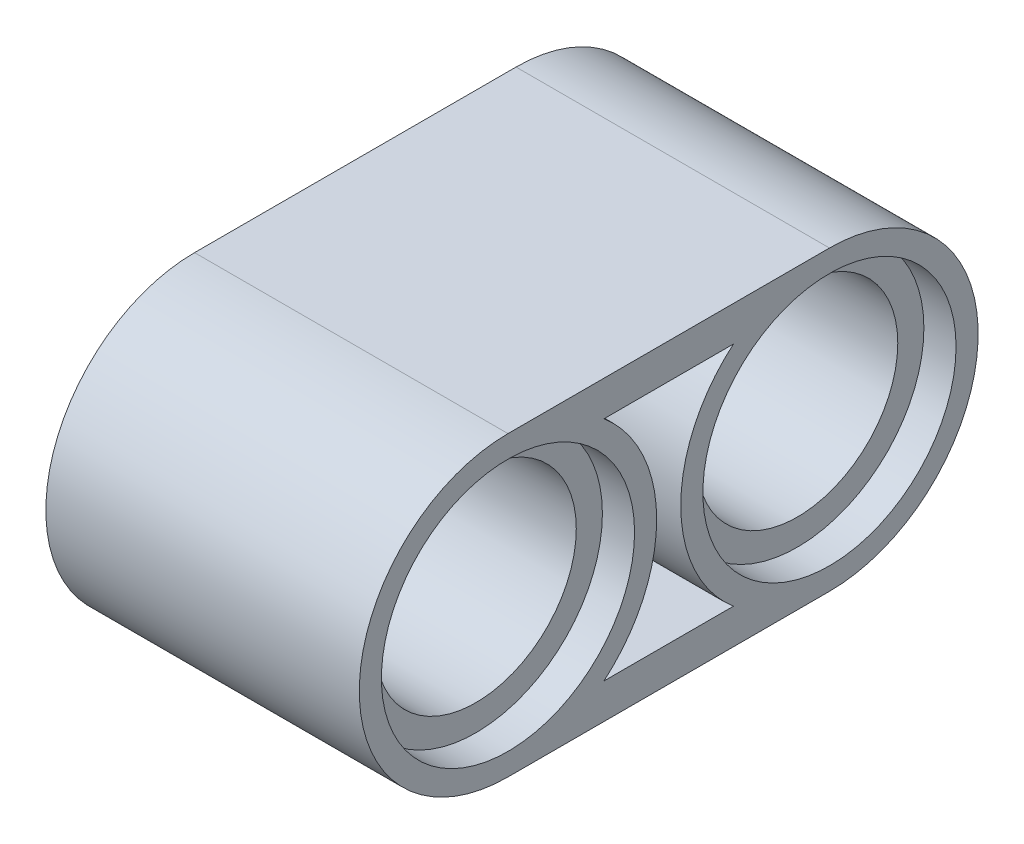
ISO-10303-21;
HEADER;
FILE_DESCRIPTION(('STEP AP214'),'2;1');
FILE_NAME('part.step','',(''),(''),'','','');
FILE_SCHEMA(('AUTOMOTIVE_DESIGN { 1 0 10303 214 1 1 1 1 }'));
ENDSEC;
DATA;
#1=APPLICATION_CONTEXT('core data for automotive mechanical design processes');
#2=APPLICATION_PROTOCOL_DEFINITION('international standard','automotive_design',2000,#1);
#3=PRODUCT_CONTEXT('',#1,'mechanical');
#4=PRODUCT('Part','Part','',(#3));
#5=PRODUCT_RELATED_PRODUCT_CATEGORY('part','',(#4));
#6=PRODUCT_DEFINITION_FORMATION('','',#4);
#7=PRODUCT_DEFINITION_CONTEXT('part definition',#1,'design');
#8=PRODUCT_DEFINITION('design','',#6,#7);
#9=PRODUCT_DEFINITION_SHAPE('','',#8);
#10=(LENGTH_UNIT() NAMED_UNIT(*) SI_UNIT(.MILLI.,.METRE.));
#11=(NAMED_UNIT(*) PLANE_ANGLE_UNIT() SI_UNIT($,.RADIAN.));
#12=(NAMED_UNIT(*) SI_UNIT($,.STERADIAN.) SOLID_ANGLE_UNIT());
#13=UNCERTAINTY_MEASURE_WITH_UNIT(LENGTH_MEASURE(1.E-05),#10,'distance_accuracy_value','');
#14=(GEOMETRIC_REPRESENTATION_CONTEXT(3) GLOBAL_UNCERTAINTY_ASSIGNED_CONTEXT((#13)) GLOBAL_UNIT_ASSIGNED_CONTEXT((#10,
#11,#12)) REPRESENTATION_CONTEXT('',''));
#15=CARTESIAN_POINT('',(0.,0.,0.));
#16=DIRECTION('',(0.,0.,1.));
#17=DIRECTION('',(1.,0.,0.));
#18=AXIS2_PLACEMENT_3D('',#15,#16,#17);
#19=CARTESIAN_POINT('',(7.8,0.,0.));
#20=DIRECTION('',(1.,0.,0.));
#21=DIRECTION('',(0.,0.,-1.));
#22=AXIS2_PLACEMENT_3D('',#19,#20,#21);
#23=PLANE('',#22);
#24=CARTESIAN_POINT('',(7.8,0.,-4.));
#25=DIRECTION('',(1.,0.,0.));
#26=DIRECTION('',(0.,0.,-1.));
#27=AXIS2_PLACEMENT_3D('',#24,#25,#26);
#28=CIRCLE('',#27,3.15);
#29=CARTESIAN_POINT('',(7.8,0.,-7.15));
#30=VERTEX_POINT('',#29);
#31=EDGE_CURVE('E44',#30,#30,#28,.T.);
#32=ORIENTED_EDGE('',*,*,#31,.F.);
#33=EDGE_LOOP('',(#32));
#34=FACE_BOUND('',#33,.T.);
#35=CARTESIAN_POINT('',(7.8,0.,4.));
#36=DIRECTION('',(1.,0.,0.));
#37=DIRECTION('',(0.,0.,-1.));
#38=AXIS2_PLACEMENT_3D('',#35,#36,#37);
#39=CIRCLE('',#38,3.15);
#40=CARTESIAN_POINT('',(7.8,0.,0.850000000000001));
#41=VERTEX_POINT('',#40);
#42=EDGE_CURVE('E232',#41,#41,#39,.T.);
#43=ORIENTED_EDGE('',*,*,#42,.F.);
#44=EDGE_LOOP('',(#43));
#45=FACE_BOUND('',#44,.T.);
#46=DIRECTION('',(0.,0.,-1.));
#47=VECTOR('',#46,1.);
#48=CARTESIAN_POINT('',(7.8,-3.7,0.));
#49=LINE('',#48,#47);
#50=CARTESIAN_POINT('',(7.8,-3.7,4.));
#51=VERTEX_POINT('',#50);
#52=CARTESIAN_POINT('',(7.8,-3.7,-4.));
#53=VERTEX_POINT('',#52);
#54=EDGE_CURVE('E264',#51,#53,#49,.T.);
#55=ORIENTED_EDGE('',*,*,#54,.T.);
#56=CARTESIAN_POINT('',(7.8,0.,-4.));
#57=DIRECTION('',(1.,0.,0.));
#58=DIRECTION('',(0.,0.,-1.));
#59=AXIS2_PLACEMENT_3D('',#56,#57,#58);
#60=CIRCLE('',#59,3.7);
#61=CARTESIAN_POINT('',(7.8,3.7,-4.));
#62=VERTEX_POINT('',#61);
#63=EDGE_CURVE('E268',#53,#62,#60,.T.);
#64=ORIENTED_EDGE('',*,*,#63,.T.);
#65=DIRECTION('',(0.,0.,-1.));
#66=VECTOR('',#65,1.);
#67=CARTESIAN_POINT('',(7.8,3.7,0.));
#68=LINE('',#67,#66);
#69=CARTESIAN_POINT('',(7.8,3.7,4.));
#70=VERTEX_POINT('',#69);
#71=EDGE_CURVE('E272',#70,#62,#68,.T.);
#72=ORIENTED_EDGE('',*,*,#71,.F.);
#73=CARTESIAN_POINT('',(7.8,0.,4.));
#74=DIRECTION('',(1.,0.,0.));
#75=DIRECTION('',(0.,0.,-1.));
#76=AXIS2_PLACEMENT_3D('',#73,#74,#75);
#77=CIRCLE('',#76,3.7);
#78=EDGE_CURVE('E276',#70,#51,#77,.T.);
#79=ORIENTED_EDGE('',*,*,#78,.T.);
#80=EDGE_LOOP('',(#55,#64,#72,#79));
#81=FACE_BOUND('',#80,.T.);
#82=DIRECTION('',(0.,0.,-1.));
#83=VECTOR('',#82,1.);
#84=CARTESIAN_POINT('',(7.8,2.825,0.));
#85=LINE('',#84,#83);
#86=CARTESIAN_POINT('',(7.8,2.825,1.6105701516889));
#87=VERTEX_POINT('',#86);
#88=CARTESIAN_POINT('',(7.8,2.825,-1.6105701516889));
#89=VERTEX_POINT('',#88);
#90=EDGE_CURVE('E200',#87,#89,#85,.T.);
#91=ORIENTED_EDGE('',*,*,#90,.T.);
#92=CARTESIAN_POINT('',(7.8,0.,-4.));
#93=DIRECTION('',(1.,0.,0.));
#94=DIRECTION('',(0.,0.,-1.));
#95=AXIS2_PLACEMENT_3D('',#92,#93,#94);
#96=CIRCLE('',#95,3.7);
#97=CARTESIAN_POINT('',(7.8,-2.825,-1.6105701516889));
#98=VERTEX_POINT('',#97);
#99=EDGE_CURVE('E66',#89,#98,#96,.T.);
#100=ORIENTED_EDGE('',*,*,#99,.T.);
#101=DIRECTION('',(0.,0.,-1.));
#102=VECTOR('',#101,1.);
#103=CARTESIAN_POINT('',(7.8,-2.825,0.));
#104=LINE('',#103,#102);
#105=CARTESIAN_POINT('',(7.8,-2.825,1.6105701516889));
#106=VERTEX_POINT('',#105);
#107=EDGE_CURVE('E187',#106,#98,#104,.T.);
#108=ORIENTED_EDGE('',*,*,#107,.F.);
#109=CARTESIAN_POINT('',(7.8,0.,4.));
#110=DIRECTION('',(1.,0.,0.));
#111=DIRECTION('',(0.,0.,-1.));
#112=AXIS2_PLACEMENT_3D('',#109,#110,#111);
#113=CIRCLE('',#112,3.7);
#114=EDGE_CURVE('E204',#106,#87,#113,.T.);
#115=ORIENTED_EDGE('',*,*,#114,.T.);
#116=EDGE_LOOP('',(#91,#100,#108,#115));
#117=FACE_BOUND('',#116,.T.);
#118=ADVANCED_FACE('F40',(#34,#45,#81,#117),#23,.T.);
#119=CARTESIAN_POINT('',(0.,0.,0.));
#120=DIRECTION('',(1.,0.,0.));
#121=DIRECTION('',(0.,0.,-1.));
#122=AXIS2_PLACEMENT_3D('',#119,#120,#121);
#123=PLANE('',#122);
#124=DIRECTION('',(0.,0.,-1.));
#125=VECTOR('',#124,1.);
#126=CARTESIAN_POINT('',(0.,-2.825,0.));
#127=LINE('',#126,#125);
#128=CARTESIAN_POINT('',(0.,-2.825,1.6105701516889));
#129=VERTEX_POINT('',#128);
#130=CARTESIAN_POINT('',(0.,-2.825,-1.6105701516889));
#131=VERTEX_POINT('',#130);
#132=EDGE_CURVE('E58',#129,#131,#127,.T.);
#133=ORIENTED_EDGE('',*,*,#132,.T.);
#134=CARTESIAN_POINT('',(0.,0.,-4.));
#135=DIRECTION('',(1.,0.,0.));
#136=DIRECTION('',(0.,0.,-1.));
#137=AXIS2_PLACEMENT_3D('',#134,#135,#136);
#138=CIRCLE('',#137,3.7);
#139=CARTESIAN_POINT('',(0.,2.825,-1.6105701516889));
#140=VERTEX_POINT('',#139);
#141=EDGE_CURVE('E150',#140,#131,#138,.T.);
#142=ORIENTED_EDGE('',*,*,#141,.F.);
#143=DIRECTION('',(0.,0.,-1.));
#144=VECTOR('',#143,1.);
#145=CARTESIAN_POINT('',(0.,2.825,0.));
#146=LINE('',#145,#144);
#147=CARTESIAN_POINT('',(0.,2.825,1.6105701516889));
#148=VERTEX_POINT('',#147);
#149=EDGE_CURVE('E169',#148,#140,#146,.T.);
#150=ORIENTED_EDGE('',*,*,#149,.F.);
#151=CARTESIAN_POINT('',(0.,0.,4.));
#152=DIRECTION('',(1.,0.,0.));
#153=DIRECTION('',(0.,0.,-1.));
#154=AXIS2_PLACEMENT_3D('',#151,#152,#153);
#155=CIRCLE('',#154,3.7);
#156=EDGE_CURVE('E143',#129,#148,#155,.T.);
#157=ORIENTED_EDGE('',*,*,#156,.F.);
#158=EDGE_LOOP('',(#133,#142,#150,#157));
#159=FACE_BOUND('',#158,.T.);
#160=CARTESIAN_POINT('',(0.,0.,4.));
#161=DIRECTION('',(1.,0.,0.));
#162=DIRECTION('',(0.,0.,-1.));
#163=AXIS2_PLACEMENT_3D('',#160,#161,#162);
#164=CIRCLE('',#163,3.15);
#165=CARTESIAN_POINT('',(0.,0.,0.850000000000001));
#166=VERTEX_POINT('',#165);
#167=EDGE_CURVE('E257',#166,#166,#164,.T.);
#168=ORIENTED_EDGE('',*,*,#167,.T.);
#169=EDGE_LOOP('',(#168));
#170=FACE_BOUND('',#169,.T.);
#171=DIRECTION('',(0.,0.,-1.));
#172=VECTOR('',#171,1.);
#173=CARTESIAN_POINT('',(0.,-3.7,0.));
#174=LINE('',#173,#172);
#175=CARTESIAN_POINT('',(0.,-3.7,4.));
#176=VERTEX_POINT('',#175);
#177=CARTESIAN_POINT('',(0.,-3.7,-4.));
#178=VERTEX_POINT('',#177);
#179=EDGE_CURVE('E248',#176,#178,#174,.T.);
#180=ORIENTED_EDGE('',*,*,#179,.F.);
#181=CARTESIAN_POINT('',(0.,0.,4.));
#182=DIRECTION('',(1.,0.,0.));
#183=DIRECTION('',(0.,0.,-1.));
#184=AXIS2_PLACEMENT_3D('',#181,#182,#183);
#185=CIRCLE('',#184,3.7);
#186=CARTESIAN_POINT('',(0.,3.7,4.));
#187=VERTEX_POINT('',#186);
#188=EDGE_CURVE('E269',#187,#176,#185,.T.);
#189=ORIENTED_EDGE('',*,*,#188,.F.);
#190=DIRECTION('',(0.,0.,-1.));
#191=VECTOR('',#190,1.);
#192=CARTESIAN_POINT('',(0.,3.7,0.));
#193=LINE('',#192,#191);
#194=CARTESIAN_POINT('',(0.,3.7,-4.));
#195=VERTEX_POINT('',#194);
#196=EDGE_CURVE('E287',#187,#195,#193,.T.);
#197=ORIENTED_EDGE('',*,*,#196,.T.);
#198=CARTESIAN_POINT('',(0.,0.,-4.));
#199=DIRECTION('',(1.,0.,0.));
#200=DIRECTION('',(0.,0.,-1.));
#201=AXIS2_PLACEMENT_3D('',#198,#199,#200);
#202=CIRCLE('',#201,3.7);
#203=EDGE_CURVE('E283',#178,#195,#202,.T.);
#204=ORIENTED_EDGE('',*,*,#203,.F.);
#205=EDGE_LOOP('',(#180,#189,#197,#204));
#206=FACE_BOUND('',#205,.T.);
#207=CARTESIAN_POINT('',(0.,0.,-4.));
#208=DIRECTION('',(1.,0.,0.));
#209=DIRECTION('',(0.,0.,-1.));
#210=AXIS2_PLACEMENT_3D('',#207,#208,#209);
#211=CIRCLE('',#210,3.15);
#212=CARTESIAN_POINT('',(0.,0.,-7.15));
#213=VERTEX_POINT('',#212);
#214=EDGE_CURVE('E244',#213,#213,#211,.T.);
#215=ORIENTED_EDGE('',*,*,#214,.T.);
#216=EDGE_LOOP('',(#215));
#217=FACE_BOUND('',#216,.T.);
#218=ADVANCED_FACE('F313',(#159,#170,#206,#217),#123,.F.);
#219=CARTESIAN_POINT('',(7.8,-3.7,0.));
#220=DIRECTION('',(0.,1.,0.));
#221=DIRECTION('',(0.,0.,1.));
#222=AXIS2_PLACEMENT_3D('',#219,#220,#221);
#223=PLANE('',#222);
#224=ORIENTED_EDGE('',*,*,#179,.T.);
#225=DIRECTION('',(-1.,0.,0.));
#226=VECTOR('',#225,1.);
#227=CARTESIAN_POINT('',(7.8,-3.7,-4.));
#228=LINE('',#227,#226);
#229=EDGE_CURVE('E11',#53,#178,#228,.T.);
#230=ORIENTED_EDGE('',*,*,#229,.F.);
#231=ORIENTED_EDGE('',*,*,#54,.F.);
#232=DIRECTION('',(-1.,0.,0.));
#233=VECTOR('',#232,1.);
#234=CARTESIAN_POINT('',(7.8,-3.7,4.));
#235=LINE('',#234,#233);
#236=EDGE_CURVE('E279',#51,#176,#235,.T.);
#237=ORIENTED_EDGE('',*,*,#236,.T.);
#238=EDGE_LOOP('',(#224,#230,#231,#237));
#239=FACE_BOUND('',#238,.T.);
#240=ADVANCED_FACE('F42',(#239),#223,.F.);
#241=CARTESIAN_POINT('',(7.8,0.,-4.));
#242=DIRECTION('',(-1.,0.,0.));
#243=DIRECTION('',(0.,0.,1.));
#244=AXIS2_PLACEMENT_3D('',#241,#242,#243);
#245=CYLINDRICAL_SURFACE('',#244,3.7);
#246=ORIENTED_EDGE('',*,*,#203,.T.);
#247=DIRECTION('',(-1.,0.,0.));
#248=VECTOR('',#247,1.);
#249=CARTESIAN_POINT('',(7.8,3.7,-4.));
#250=LINE('',#249,#248);
#251=EDGE_CURVE('E50',#62,#195,#250,.T.);
#252=ORIENTED_EDGE('',*,*,#251,.F.);
#253=ORIENTED_EDGE('',*,*,#63,.F.);
#254=ORIENTED_EDGE('',*,*,#229,.T.);
#255=EDGE_LOOP('',(#246,#252,#253,#254));
#256=FACE_BOUND('',#255,.T.);
#257=ADVANCED_FACE('F395',(#256),#245,.T.);
#258=CARTESIAN_POINT('',(7.8,3.7,0.));
#259=DIRECTION('',(0.,1.,0.));
#260=DIRECTION('',(0.,0.,1.));
#261=AXIS2_PLACEMENT_3D('',#258,#259,#260);
#262=PLANE('',#261);
#263=ORIENTED_EDGE('',*,*,#196,.F.);
#264=DIRECTION('',(-1.,0.,0.));
#265=VECTOR('',#264,1.);
#266=CARTESIAN_POINT('',(7.8,3.7,4.));
#267=LINE('',#266,#265);
#268=EDGE_CURVE('E296',#70,#187,#267,.T.);
#269=ORIENTED_EDGE('',*,*,#268,.F.);
#270=ORIENTED_EDGE('',*,*,#71,.T.);
#271=ORIENTED_EDGE('',*,*,#251,.T.);
#272=EDGE_LOOP('',(#263,#269,#270,#271));
#273=FACE_BOUND('',#272,.T.);
#274=ADVANCED_FACE('F392',(#273),#262,.T.);
#275=CARTESIAN_POINT('',(7.8,0.,4.));
#276=DIRECTION('',(-1.,0.,0.));
#277=DIRECTION('',(0.,0.,1.));
#278=AXIS2_PLACEMENT_3D('',#275,#276,#277);
#279=CYLINDRICAL_SURFACE('',#278,3.7);
#280=ORIENTED_EDGE('',*,*,#188,.T.);
#281=ORIENTED_EDGE('',*,*,#236,.F.);
#282=ORIENTED_EDGE('',*,*,#78,.F.);
#283=ORIENTED_EDGE('',*,*,#268,.T.);
#284=EDGE_LOOP('',(#280,#281,#282,#283));
#285=FACE_BOUND('',#284,.T.);
#286=ADVANCED_FACE('F384',(#285),#279,.T.);
#287=CARTESIAN_POINT('',(-1.2E-05,0.,-4.));
#288=DIRECTION('',(1.,0.,0.));
#289=DIRECTION('',(0.,0.,-1.));
#290=AXIS2_PLACEMENT_3D('',#287,#288,#289);
#291=CYLINDRICAL_SURFACE('',#290,2.5);
#292=CARTESIAN_POINT('',(7.,0.,-4.));
#293=DIRECTION('',(1.,0.,0.));
#294=DIRECTION('',(0.,0.,-1.));
#295=AXIS2_PLACEMENT_3D('',#292,#293,#294);
#296=CIRCLE('',#295,2.5);
#297=CARTESIAN_POINT('',(7.,0.,-6.5));
#298=VERTEX_POINT('',#297);
#299=EDGE_CURVE('E223',#298,#298,#296,.T.);
#300=CARTESIAN_POINT('',(1.,0.,-4.));
#301=DIRECTION('',(1.,0.,0.));
#302=DIRECTION('',(0.,0.,-1.));
#303=AXIS2_PLACEMENT_3D('',#300,#301,#302);
#304=CIRCLE('',#303,2.5);
#305=CARTESIAN_POINT('',(1.,0.,-6.5));
#306=VERTEX_POINT('',#305);
#307=EDGE_CURVE('E239',#306,#306,#304,.T.);
#308=CARTESIAN_POINT('',(7.,0.,-6.5));
#309=CARTESIAN_POINT('',(6.9375,0.,-6.5));
#310=CARTESIAN_POINT('',(6.875,0.,-6.5));
#311=CARTESIAN_POINT('',(6.75,0.,-6.5));
#312=CARTESIAN_POINT('',(6.6875,0.,-6.5));
#313=CARTESIAN_POINT('',(6.5625,0.,-6.5));
#314=CARTESIAN_POINT('',(6.5,0.,-6.5));
#315=CARTESIAN_POINT('',(6.375,0.,-6.5));
#316=CARTESIAN_POINT('',(6.3125,0.,-6.5));
#317=CARTESIAN_POINT('',(6.1875,0.,-6.5));
#318=CARTESIAN_POINT('',(6.125,0.,-6.5));
#319=CARTESIAN_POINT('',(6.,0.,-6.5));
#320=CARTESIAN_POINT('',(5.9375,0.,-6.5));
#321=CARTESIAN_POINT('',(5.8125,0.,-6.5));
#322=CARTESIAN_POINT('',(5.75,0.,-6.5));
#323=CARTESIAN_POINT('',(5.625,0.,-6.5));
#324=CARTESIAN_POINT('',(5.5625,0.,-6.5));
#325=CARTESIAN_POINT('',(5.4375,0.,-6.5));
#326=CARTESIAN_POINT('',(5.375,0.,-6.5));
#327=CARTESIAN_POINT('',(5.25,0.,-6.5));
#328=CARTESIAN_POINT('',(5.1875,0.,-6.5));
#329=CARTESIAN_POINT('',(5.0625,0.,-6.5));
#330=CARTESIAN_POINT('',(5.,0.,-6.5));
#331=CARTESIAN_POINT('',(4.875,0.,-6.5));
#332=CARTESIAN_POINT('',(4.8125,0.,-6.5));
#333=CARTESIAN_POINT('',(4.6875,0.,-6.5));
#334=CARTESIAN_POINT('',(4.625,0.,-6.5));
#335=CARTESIAN_POINT('',(4.5,0.,-6.5));
#336=CARTESIAN_POINT('',(4.4375,0.,-6.5));
#337=CARTESIAN_POINT('',(4.3125,0.,-6.5));
#338=CARTESIAN_POINT('',(4.25,0.,-6.5));
#339=CARTESIAN_POINT('',(4.125,0.,-6.5));
#340=CARTESIAN_POINT('',(4.0625,0.,-6.5));
#341=CARTESIAN_POINT('',(3.9375,0.,-6.5));
#342=CARTESIAN_POINT('',(3.875,0.,-6.5));
#343=CARTESIAN_POINT('',(3.75,0.,-6.5));
#344=CARTESIAN_POINT('',(3.6875,0.,-6.5));
#345=CARTESIAN_POINT('',(3.5625,0.,-6.5));
#346=CARTESIAN_POINT('',(3.5,0.,-6.5));
#347=CARTESIAN_POINT('',(3.375,0.,-6.5));
#348=CARTESIAN_POINT('',(3.3125,0.,-6.5));
#349=CARTESIAN_POINT('',(3.1875,0.,-6.5));
#350=CARTESIAN_POINT('',(3.125,0.,-6.5));
#351=CARTESIAN_POINT('',(3.,0.,-6.5));
#352=CARTESIAN_POINT('',(2.9375,0.,-6.5));
#353=CARTESIAN_POINT('',(2.8125,0.,-6.5));
#354=CARTESIAN_POINT('',(2.75,0.,-6.5));
#355=CARTESIAN_POINT('',(2.625,0.,-6.5));
#356=CARTESIAN_POINT('',(2.5625,0.,-6.5));
#357=CARTESIAN_POINT('',(2.4375,0.,-6.5));
#358=CARTESIAN_POINT('',(2.375,0.,-6.5));
#359=CARTESIAN_POINT('',(2.25,0.,-6.5));
#360=CARTESIAN_POINT('',(2.1875,0.,-6.5));
#361=CARTESIAN_POINT('',(2.0625,0.,-6.5));
#362=CARTESIAN_POINT('',(2.,0.,-6.5));
#363=CARTESIAN_POINT('',(1.875,0.,-6.5));
#364=CARTESIAN_POINT('',(1.8125,0.,-6.5));
#365=CARTESIAN_POINT('',(1.6875,0.,-6.5));
#366=CARTESIAN_POINT('',(1.625,0.,-6.5));
#367=CARTESIAN_POINT('',(1.5,0.,-6.5));
#368=CARTESIAN_POINT('',(1.4375,0.,-6.5));
#369=CARTESIAN_POINT('',(1.3125,0.,-6.5));
#370=CARTESIAN_POINT('',(1.25,0.,-6.5));
#371=CARTESIAN_POINT('',(1.125,0.,-6.5));
#372=CARTESIAN_POINT('',(1.0625,0.,-6.5));
#373=CARTESIAN_POINT('',(1.,0.,-6.5));
#374=B_SPLINE_CURVE_WITH_KNOTS('',3,(#308,#309,#310,#311,#312,#313,#314,#315,#316,#317,#318,
#319,#320,#321,#322,#323,#324,#325,#326,#327,#328,#329,#330,#331,#332,#333,#334,#335,#336,#337,
#338,#339,#340,#341,#342,#343,#344,#345,#346,#347,#348,#349,#350,#351,#352,#353,#354,#355,#356,
#357,#358,#359,#360,#361,#362,#363,#364,#365,#366,#367,#368,#369,#370,#371,#372,#373),
.UNSPECIFIED.,.F.,.F.,(4,2,2,2,2,2,2,2,2,2,2,2,2,2,2,2,2,2,2,2,2,2,2,2,2,2,2,2,2,2,2,2,4),(0.,
0.1875,0.375,0.5625,0.75,0.9375,1.125,1.3125,1.5,1.6875,1.875,2.0625,2.25,2.4375,2.625,2.8125,
3.,3.1875,3.375,3.5625,3.75,3.9375,4.125,4.3125,4.5,4.6875,4.875,5.0625,5.25,5.4375,5.625,
5.8125,6.),.UNSPECIFIED.);
#375=EDGE_CURVE('BSEAM381',#298,#306,#374,.T.);
#376=ORIENTED_EDGE('',*,*,#299,.T.);
#377=ORIENTED_EDGE('',*,*,#307,.F.);
#378=ORIENTED_EDGE('',*,*,#375,.T.);
#379=ORIENTED_EDGE('',*,*,#375,.F.);
#380=EDGE_LOOP('',(#376,#378,#377,#379));
#381=FACE_BOUND('',#380,.T.);
#382=ADVANCED_FACE('F381',(#381),#291,.F.);
#383=CARTESIAN_POINT('',(-1.2E-05,0.,4.));
#384=DIRECTION('',(1.,0.,0.));
#385=DIRECTION('',(0.,0.,-1.));
#386=AXIS2_PLACEMENT_3D('',#383,#384,#385);
#387=CYLINDRICAL_SURFACE('',#386,2.5);
#388=CARTESIAN_POINT('',(7.,0.,4.));
#389=DIRECTION('',(1.,0.,0.));
#390=DIRECTION('',(0.,0.,-1.));
#391=AXIS2_PLACEMENT_3D('',#388,#389,#390);
#392=CIRCLE('',#391,2.5);
#393=CARTESIAN_POINT('',(7.,0.,1.5));
#394=VERTEX_POINT('',#393);
#395=EDGE_CURVE('E228',#394,#394,#392,.T.);
#396=CARTESIAN_POINT('',(1.,0.,4.));
#397=DIRECTION('',(1.,0.,0.));
#398=DIRECTION('',(0.,0.,-1.));
#399=AXIS2_PLACEMENT_3D('',#396,#397,#398);
#400=CIRCLE('',#399,2.5);
#401=CARTESIAN_POINT('',(1.,0.,1.5));
#402=VERTEX_POINT('',#401);
#403=EDGE_CURVE('E252',#402,#402,#400,.T.);
#404=CARTESIAN_POINT('',(7.,0.,1.5));
#405=CARTESIAN_POINT('',(6.9375,0.,1.5));
#406=CARTESIAN_POINT('',(6.875,0.,1.5));
#407=CARTESIAN_POINT('',(6.75,0.,1.5));
#408=CARTESIAN_POINT('',(6.6875,0.,1.5));
#409=CARTESIAN_POINT('',(6.5625,0.,1.5));
#410=CARTESIAN_POINT('',(6.5,0.,1.5));
#411=CARTESIAN_POINT('',(6.375,0.,1.5));
#412=CARTESIAN_POINT('',(6.3125,0.,1.5));
#413=CARTESIAN_POINT('',(6.1875,0.,1.5));
#414=CARTESIAN_POINT('',(6.125,0.,1.5));
#415=CARTESIAN_POINT('',(6.,0.,1.5));
#416=CARTESIAN_POINT('',(5.9375,0.,1.5));
#417=CARTESIAN_POINT('',(5.8125,0.,1.5));
#418=CARTESIAN_POINT('',(5.75,0.,1.5));
#419=CARTESIAN_POINT('',(5.625,0.,1.5));
#420=CARTESIAN_POINT('',(5.5625,0.,1.5));
#421=CARTESIAN_POINT('',(5.4375,0.,1.5));
#422=CARTESIAN_POINT('',(5.375,0.,1.5));
#423=CARTESIAN_POINT('',(5.25,0.,1.5));
#424=CARTESIAN_POINT('',(5.1875,0.,1.5));
#425=CARTESIAN_POINT('',(5.0625,0.,1.5));
#426=CARTESIAN_POINT('',(5.,0.,1.5));
#427=CARTESIAN_POINT('',(4.875,0.,1.5));
#428=CARTESIAN_POINT('',(4.8125,0.,1.5));
#429=CARTESIAN_POINT('',(4.6875,0.,1.5));
#430=CARTESIAN_POINT('',(4.625,0.,1.5));
#431=CARTESIAN_POINT('',(4.5,0.,1.5));
#432=CARTESIAN_POINT('',(4.4375,0.,1.5));
#433=CARTESIAN_POINT('',(4.3125,0.,1.5));
#434=CARTESIAN_POINT('',(4.25,0.,1.5));
#435=CARTESIAN_POINT('',(4.125,0.,1.5));
#436=CARTESIAN_POINT('',(4.0625,0.,1.5));
#437=CARTESIAN_POINT('',(3.9375,0.,1.5));
#438=CARTESIAN_POINT('',(3.875,0.,1.5));
#439=CARTESIAN_POINT('',(3.75,0.,1.5));
#440=CARTESIAN_POINT('',(3.6875,0.,1.5));
#441=CARTESIAN_POINT('',(3.5625,0.,1.5));
#442=CARTESIAN_POINT('',(3.5,0.,1.5));
#443=CARTESIAN_POINT('',(3.375,0.,1.5));
#444=CARTESIAN_POINT('',(3.3125,0.,1.5));
#445=CARTESIAN_POINT('',(3.1875,0.,1.5));
#446=CARTESIAN_POINT('',(3.125,0.,1.5));
#447=CARTESIAN_POINT('',(3.,0.,1.5));
#448=CARTESIAN_POINT('',(2.9375,0.,1.5));
#449=CARTESIAN_POINT('',(2.8125,0.,1.5));
#450=CARTESIAN_POINT('',(2.75,0.,1.5));
#451=CARTESIAN_POINT('',(2.625,0.,1.5));
#452=CARTESIAN_POINT('',(2.5625,0.,1.5));
#453=CARTESIAN_POINT('',(2.4375,0.,1.5));
#454=CARTESIAN_POINT('',(2.375,0.,1.5));
#455=CARTESIAN_POINT('',(2.25,0.,1.5));
#456=CARTESIAN_POINT('',(2.1875,0.,1.5));
#457=CARTESIAN_POINT('',(2.0625,0.,1.5));
#458=CARTESIAN_POINT('',(2.,0.,1.5));
#459=CARTESIAN_POINT('',(1.875,0.,1.5));
#460=CARTESIAN_POINT('',(1.8125,0.,1.5));
#461=CARTESIAN_POINT('',(1.6875,0.,1.5));
#462=CARTESIAN_POINT('',(1.625,0.,1.5));
#463=CARTESIAN_POINT('',(1.5,0.,1.5));
#464=CARTESIAN_POINT('',(1.4375,0.,1.5));
#465=CARTESIAN_POINT('',(1.3125,0.,1.5));
#466=CARTESIAN_POINT('',(1.25,0.,1.5));
#467=CARTESIAN_POINT('',(1.125,0.,1.5));
#468=CARTESIAN_POINT('',(1.0625,0.,1.5));
#469=CARTESIAN_POINT('',(1.,0.,1.5));
#470=B_SPLINE_CURVE_WITH_KNOTS('',3,(#404,#405,#406,#407,#408,#409,#410,#411,#412,#413,#414,
#415,#416,#417,#418,#419,#420,#421,#422,#423,#424,#425,#426,#427,#428,#429,#430,#431,#432,#433,
#434,#435,#436,#437,#438,#439,#440,#441,#442,#443,#444,#445,#446,#447,#448,#449,#450,#451,#452,
#453,#454,#455,#456,#457,#458,#459,#460,#461,#462,#463,#464,#465,#466,#467,#468,#469),
.UNSPECIFIED.,.F.,.F.,(4,2,2,2,2,2,2,2,2,2,2,2,2,2,2,2,2,2,2,2,2,2,2,2,2,2,2,2,2,2,2,2,4),(0.,
0.1875,0.375,0.5625,0.75,0.9375,1.125,1.3125,1.5,1.6875,1.875,2.0625,2.25,2.4375,2.625,2.8125,
3.,3.1875,3.375,3.5625,3.75,3.9375,4.125,4.3125,4.5,4.6875,4.875,5.0625,5.25,5.4375,5.625,
5.8125,6.),.UNSPECIFIED.);
#471=EDGE_CURVE('BSEAM377',#394,#402,#470,.T.);
#472=ORIENTED_EDGE('',*,*,#395,.T.);
#473=ORIENTED_EDGE('',*,*,#403,.F.);
#474=ORIENTED_EDGE('',*,*,#471,.T.);
#475=ORIENTED_EDGE('',*,*,#471,.F.);
#476=EDGE_LOOP('',(#472,#474,#473,#475));
#477=FACE_BOUND('',#476,.T.);
#478=ADVANCED_FACE('F377',(#477),#387,.F.);
#479=CARTESIAN_POINT('',(1.,0.,4.));
#480=DIRECTION('',(-1.,0.,0.));
#481=DIRECTION('',(0.,0.,1.));
#482=AXIS2_PLACEMENT_3D('',#479,#480,#481);
#483=CYLINDRICAL_SURFACE('',#482,3.15);
#484=CARTESIAN_POINT('',(1.,0.,4.));
#485=DIRECTION('',(1.,0.,0.));
#486=DIRECTION('',(0.,0.,-1.));
#487=AXIS2_PLACEMENT_3D('',#484,#485,#486);
#488=CIRCLE('',#487,3.15);
#489=CARTESIAN_POINT('',(1.,0.,0.850000000000001));
#490=VERTEX_POINT('',#489);
#491=EDGE_CURVE('E253',#490,#490,#488,.T.);
#492=ORIENTED_EDGE('',*,*,#491,.T.);
#493=EDGE_LOOP('',(#492));
#494=FACE_BOUND('',#493,.T.);
#495=ORIENTED_EDGE('',*,*,#167,.F.);
#496=EDGE_LOOP('',(#495));
#497=FACE_BOUND('',#496,.T.);
#498=ADVANCED_FACE('F373',(#494,#497),#483,.F.);
#499=CARTESIAN_POINT('',(1.,0.,0.));
#500=DIRECTION('',(1.,0.,0.));
#501=DIRECTION('',(0.,0.,-1.));
#502=AXIS2_PLACEMENT_3D('',#499,#500,#501);
#503=PLANE('',#502);
#504=ORIENTED_EDGE('',*,*,#491,.F.);
#505=EDGE_LOOP('',(#504));
#506=FACE_BOUND('',#505,.T.);
#507=ORIENTED_EDGE('',*,*,#403,.T.);
#508=EDGE_LOOP('',(#507));
#509=FACE_BOUND('',#508,.T.);
#510=ADVANCED_FACE('F369',(#506,#509),#503,.F.);
#511=CARTESIAN_POINT('',(1.,0.,-4.));
#512=DIRECTION('',(-1.,0.,0.));
#513=DIRECTION('',(0.,0.,1.));
#514=AXIS2_PLACEMENT_3D('',#511,#512,#513);
#515=CYLINDRICAL_SURFACE('',#514,3.15);
#516=CARTESIAN_POINT('',(1.,0.,-4.));
#517=DIRECTION('',(1.,0.,0.));
#518=DIRECTION('',(0.,0.,-1.));
#519=AXIS2_PLACEMENT_3D('',#516,#517,#518);
#520=CIRCLE('',#519,3.15);
#521=CARTESIAN_POINT('',(1.,0.,-7.15));
#522=VERTEX_POINT('',#521);
#523=EDGE_CURVE('E243',#522,#522,#520,.T.);
#524=ORIENTED_EDGE('',*,*,#523,.T.);
#525=EDGE_LOOP('',(#524));
#526=FACE_BOUND('',#525,.T.);
#527=ORIENTED_EDGE('',*,*,#214,.F.);
#528=EDGE_LOOP('',(#527));
#529=FACE_BOUND('',#528,.T.);
#530=ADVANCED_FACE('F365',(#526,#529),#515,.F.);
#531=CARTESIAN_POINT('',(1.,0.,0.));
#532=DIRECTION('',(1.,0.,0.));
#533=DIRECTION('',(0.,0.,-1.));
#534=AXIS2_PLACEMENT_3D('',#531,#532,#533);
#535=PLANE('',#534);
#536=ORIENTED_EDGE('',*,*,#307,.T.);
#537=EDGE_LOOP('',(#536));
#538=FACE_BOUND('',#537,.T.);
#539=ORIENTED_EDGE('',*,*,#523,.F.);
#540=EDGE_LOOP('',(#539));
#541=FACE_BOUND('',#540,.T.);
#542=ADVANCED_FACE('F362',(#538,#541),#535,.F.);
#543=CARTESIAN_POINT('',(7.,0.,4.));
#544=DIRECTION('',(1.,0.,0.));
#545=DIRECTION('',(0.,0.,-1.));
#546=AXIS2_PLACEMENT_3D('',#543,#544,#545);
#547=CYLINDRICAL_SURFACE('',#546,3.15);
#548=ORIENTED_EDGE('',*,*,#42,.T.);
#549=EDGE_LOOP('',(#548));
#550=FACE_BOUND('',#549,.T.);
#551=CARTESIAN_POINT('',(7.,0.,4.));
#552=DIRECTION('',(1.,0.,0.));
#553=DIRECTION('',(0.,0.,-1.));
#554=AXIS2_PLACEMENT_3D('',#551,#552,#553);
#555=CIRCLE('',#554,3.15);
#556=CARTESIAN_POINT('',(7.,0.,0.850000000000001));
#557=VERTEX_POINT('',#556);
#558=EDGE_CURVE('E214',#557,#557,#555,.T.);
#559=ORIENTED_EDGE('',*,*,#558,.F.);
#560=EDGE_LOOP('',(#559));
#561=FACE_BOUND('',#560,.T.);
#562=ADVANCED_FACE('F358',(#550,#561),#547,.F.);
#563=CARTESIAN_POINT('',(7.,0.,0.));
#564=DIRECTION('',(-1.,0.,0.));
#565=DIRECTION('',(0.,0.,-1.));
#566=AXIS2_PLACEMENT_3D('',#563,#564,#565);
#567=PLANE('',#566);
#568=ORIENTED_EDGE('',*,*,#558,.T.);
#569=EDGE_LOOP('',(#568));
#570=FACE_BOUND('',#569,.T.);
#571=ORIENTED_EDGE('',*,*,#395,.F.);
#572=EDGE_LOOP('',(#571));
#573=FACE_BOUND('',#572,.T.);
#574=ADVANCED_FACE('F355',(#570,#573),#567,.F.);
#575=CARTESIAN_POINT('',(7.,0.,-4.));
#576=DIRECTION('',(1.,0.,0.));
#577=DIRECTION('',(0.,0.,-1.));
#578=AXIS2_PLACEMENT_3D('',#575,#576,#577);
#579=CYLINDRICAL_SURFACE('',#578,3.15);
#580=ORIENTED_EDGE('',*,*,#31,.T.);
#581=EDGE_LOOP('',(#580));
#582=FACE_BOUND('',#581,.T.);
#583=CARTESIAN_POINT('',(7.,0.,-4.));
#584=DIRECTION('',(1.,0.,0.));
#585=DIRECTION('',(0.,0.,-1.));
#586=AXIS2_PLACEMENT_3D('',#583,#584,#585);
#587=CIRCLE('',#586,3.15);
#588=CARTESIAN_POINT('',(7.,0.,-7.15));
#589=VERTEX_POINT('',#588);
#590=EDGE_CURVE('E227',#589,#589,#587,.T.);
#591=ORIENTED_EDGE('',*,*,#590,.F.);
#592=EDGE_LOOP('',(#591));
#593=FACE_BOUND('',#592,.T.);
#594=ADVANCED_FACE('F308',(#582,#593),#579,.F.);
#595=CARTESIAN_POINT('',(7.,0.,0.));
#596=DIRECTION('',(-1.,0.,0.));
#597=DIRECTION('',(0.,0.,-1.));
#598=AXIS2_PLACEMENT_3D('',#595,#596,#597);
#599=PLANE('',#598);
#600=ORIENTED_EDGE('',*,*,#299,.F.);
#601=EDGE_LOOP('',(#600));
#602=FACE_BOUND('',#601,.T.);
#603=ORIENTED_EDGE('',*,*,#590,.T.);
#604=EDGE_LOOP('',(#603));
#605=FACE_BOUND('',#604,.T.);
#606=ADVANCED_FACE('F349',(#602,#605),#599,.F.);
#607=CARTESIAN_POINT('',(5.8,0.,-4.));
#608=DIRECTION('',(1.,0.,0.));
#609=DIRECTION('',(0.,0.,-1.));
#610=AXIS2_PLACEMENT_3D('',#607,#608,#609);
#611=CYLINDRICAL_SURFACE('',#610,3.7);
#612=ORIENTED_EDGE('',*,*,#99,.F.);
#613=DIRECTION('',(1.,0.,0.));
#614=VECTOR('',#613,1.);
#615=CARTESIAN_POINT('',(5.8,2.825,-1.6105701516889));
#616=LINE('',#615,#614);
#617=CARTESIAN_POINT('',(5.8,2.825,-1.6105701516889));
#618=VERTEX_POINT('',#617);
#619=EDGE_CURVE('E197',#618,#89,#616,.T.);
#620=ORIENTED_EDGE('',*,*,#619,.F.);
#621=CARTESIAN_POINT('',(5.8,0.,-4.));
#622=DIRECTION('',(1.,0.,0.));
#623=DIRECTION('',(0.,0.,-1.));
#624=AXIS2_PLACEMENT_3D('',#621,#622,#623);
#625=CIRCLE('',#624,3.7);
#626=CARTESIAN_POINT('',(5.8,-2.825,-1.6105701516889));
#627=VERTEX_POINT('',#626);
#628=EDGE_CURVE('E183',#618,#627,#625,.T.);
#629=ORIENTED_EDGE('',*,*,#628,.T.);
#630=DIRECTION('',(1.,0.,0.));
#631=VECTOR('',#630,1.);
#632=CARTESIAN_POINT('',(5.8,-2.825,-1.6105701516889));
#633=LINE('',#632,#631);
#634=EDGE_CURVE('E211',#627,#98,#633,.T.);
#635=ORIENTED_EDGE('',*,*,#634,.T.);
#636=EDGE_LOOP('',(#612,#620,#629,#635));
#637=FACE_BOUND('',#636,.T.);
#638=ADVANCED_FACE('F327',(#637),#611,.T.);
#639=CARTESIAN_POINT('',(5.8,-2.825,0.));
#640=DIRECTION('',(0.,-1.,0.));
#641=DIRECTION('',(0.,0.,-1.));
#642=AXIS2_PLACEMENT_3D('',#639,#640,#641);
#643=PLANE('',#642);
#644=ORIENTED_EDGE('',*,*,#107,.T.);
#645=ORIENTED_EDGE('',*,*,#634,.F.);
#646=DIRECTION('',(0.,0.,-1.));
#647=VECTOR('',#646,1.);
#648=CARTESIAN_POINT('',(5.8,-2.825,0.));
#649=LINE('',#648,#647);
#650=CARTESIAN_POINT('',(5.8,-2.825,1.6105701516889));
#651=VERTEX_POINT('',#650);
#652=EDGE_CURVE('E193',#651,#627,#649,.T.);
#653=ORIENTED_EDGE('',*,*,#652,.F.);
#654=DIRECTION('',(1.,0.,0.));
#655=VECTOR('',#654,1.);
#656=CARTESIAN_POINT('',(5.8,-2.825,1.6105701516889));
#657=LINE('',#656,#655);
#658=EDGE_CURVE('E215',#651,#106,#657,.T.);
#659=ORIENTED_EDGE('',*,*,#658,.T.);
#660=EDGE_LOOP('',(#644,#645,#653,#659));
#661=FACE_BOUND('',#660,.T.);
#662=ADVANCED_FACE('F334',(#661),#643,.F.);
#663=CARTESIAN_POINT('',(5.8,0.,4.));
#664=DIRECTION('',(1.,0.,0.));
#665=DIRECTION('',(0.,0.,-1.));
#666=AXIS2_PLACEMENT_3D('',#663,#664,#665);
#667=CYLINDRICAL_SURFACE('',#666,3.7);
#668=ORIENTED_EDGE('',*,*,#114,.F.);
#669=ORIENTED_EDGE('',*,*,#658,.F.);
#670=CARTESIAN_POINT('',(5.8,0.,4.));
#671=DIRECTION('',(1.,0.,0.));
#672=DIRECTION('',(0.,0.,-1.));
#673=AXIS2_PLACEMENT_3D('',#670,#671,#672);
#674=CIRCLE('',#673,3.7);
#675=CARTESIAN_POINT('',(5.8,2.825,1.6105701516889));
#676=VERTEX_POINT('',#675);
#677=EDGE_CURVE('E190',#651,#676,#674,.T.);
#678=ORIENTED_EDGE('',*,*,#677,.T.);
#679=DIRECTION('',(1.,0.,0.));
#680=VECTOR('',#679,1.);
#681=CARTESIAN_POINT('',(5.8,2.825,1.6105701516889));
#682=LINE('',#681,#680);
#683=EDGE_CURVE('E218',#676,#87,#682,.T.);
#684=ORIENTED_EDGE('',*,*,#683,.T.);
#685=EDGE_LOOP('',(#668,#669,#678,#684));
#686=FACE_BOUND('',#685,.T.);
#687=ADVANCED_FACE('F336',(#686),#667,.T.);
#688=CARTESIAN_POINT('',(5.8,2.825,0.));
#689=DIRECTION('',(0.,-1.,0.));
#690=DIRECTION('',(0.,0.,-1.));
#691=AXIS2_PLACEMENT_3D('',#688,#689,#690);
#692=PLANE('',#691);
#693=ORIENTED_EDGE('',*,*,#90,.F.);
#694=ORIENTED_EDGE('',*,*,#683,.F.);
#695=DIRECTION('',(0.,0.,-1.));
#696=VECTOR('',#695,1.);
#697=CARTESIAN_POINT('',(5.8,2.825,0.));
#698=LINE('',#697,#696);
#699=EDGE_CURVE('E186',#676,#618,#698,.T.);
#700=ORIENTED_EDGE('',*,*,#699,.T.);
#701=ORIENTED_EDGE('',*,*,#619,.T.);
#702=EDGE_LOOP('',(#693,#694,#700,#701));
#703=FACE_BOUND('',#702,.T.);
#704=ADVANCED_FACE('F324',(#703),#692,.T.);
#705=CARTESIAN_POINT('',(5.8,0.,0.));
#706=DIRECTION('',(1.,0.,0.));
#707=DIRECTION('',(0.,0.,-1.));
#708=AXIS2_PLACEMENT_3D('',#705,#706,#707);
#709=PLANE('',#708);
#710=ORIENTED_EDGE('',*,*,#628,.F.);
#711=ORIENTED_EDGE('',*,*,#699,.F.);
#712=ORIENTED_EDGE('',*,*,#677,.F.);
#713=ORIENTED_EDGE('',*,*,#652,.T.);
#714=EDGE_LOOP('',(#710,#711,#712,#713));
#715=FACE_BOUND('',#714,.T.);
#716=ADVANCED_FACE('F330',(#715),#709,.T.);
#717=CARTESIAN_POINT('',(2.,-2.825,0.));
#718=DIRECTION('',(0.,1.,0.));
#719=DIRECTION('',(0.,0.,1.));
#720=AXIS2_PLACEMENT_3D('',#717,#718,#719);
#721=PLANE('',#720);
#722=ORIENTED_EDGE('',*,*,#132,.F.);
#723=DIRECTION('',(-1.,0.,0.));
#724=VECTOR('',#723,1.);
#725=CARTESIAN_POINT('',(2.,-2.825,1.6105701516889));
#726=LINE('',#725,#724);
#727=CARTESIAN_POINT('',(2.,-2.825,1.6105701516889));
#728=VERTEX_POINT('',#727);
#729=EDGE_CURVE('E136',#728,#129,#726,.T.);
#730=ORIENTED_EDGE('',*,*,#729,.F.);
#731=DIRECTION('',(0.,0.,-1.));
#732=VECTOR('',#731,1.);
#733=CARTESIAN_POINT('',(2.,-2.825,0.));
#734=LINE('',#733,#732);
#735=CARTESIAN_POINT('',(2.,-2.825,-1.6105701516889));
#736=VERTEX_POINT('',#735);
#737=EDGE_CURVE('E131',#728,#736,#734,.T.);
#738=ORIENTED_EDGE('',*,*,#737,.T.);
#739=DIRECTION('',(-1.,0.,0.));
#740=VECTOR('',#739,1.);
#741=CARTESIAN_POINT('',(2.,-2.825,-1.6105701516889));
#742=LINE('',#741,#740);
#743=EDGE_CURVE('E134',#736,#131,#742,.T.);
#744=ORIENTED_EDGE('',*,*,#743,.T.);
#745=EDGE_LOOP('',(#722,#730,#738,#744));
#746=FACE_BOUND('',#745,.T.);
#747=ADVANCED_FACE('F133',(#746),#721,.T.);
#748=CARTESIAN_POINT('',(2.,0.,-4.));
#749=DIRECTION('',(-1.,0.,0.));
#750=DIRECTION('',(0.,0.,1.));
#751=AXIS2_PLACEMENT_3D('',#748,#749,#750);
#752=CYLINDRICAL_SURFACE('',#751,3.7);
#753=ORIENTED_EDGE('',*,*,#141,.T.);
#754=ORIENTED_EDGE('',*,*,#743,.F.);
#755=CARTESIAN_POINT('',(2.,0.,-4.));
#756=DIRECTION('',(1.,0.,0.));
#757=DIRECTION('',(0.,0.,-1.));
#758=AXIS2_PLACEMENT_3D('',#755,#756,#757);
#759=CIRCLE('',#758,3.7);
#760=CARTESIAN_POINT('',(2.,2.825,-1.6105701516889));
#761=VERTEX_POINT('',#760);
#762=EDGE_CURVE('E142',#761,#736,#759,.T.);
#763=ORIENTED_EDGE('',*,*,#762,.F.);
#764=DIRECTION('',(-1.,0.,0.));
#765=VECTOR('',#764,1.);
#766=CARTESIAN_POINT('',(2.,2.825,-1.6105701516889));
#767=LINE('',#766,#765);
#768=EDGE_CURVE('E152',#761,#140,#767,.T.);
#769=ORIENTED_EDGE('',*,*,#768,.T.);
#770=EDGE_LOOP('',(#753,#754,#763,#769));
#771=FACE_BOUND('',#770,.T.);
#772=ADVANCED_FACE('F147',(#771),#752,.T.);
#773=CARTESIAN_POINT('',(2.,2.825,0.));
#774=DIRECTION('',(0.,1.,0.));
#775=DIRECTION('',(0.,0.,1.));
#776=AXIS2_PLACEMENT_3D('',#773,#774,#775);
#777=PLANE('',#776);
#778=ORIENTED_EDGE('',*,*,#149,.T.);
#779=ORIENTED_EDGE('',*,*,#768,.F.);
#780=DIRECTION('',(0.,0.,-1.));
#781=VECTOR('',#780,1.);
#782=CARTESIAN_POINT('',(2.,2.825,0.));
#783=LINE('',#782,#781);
#784=CARTESIAN_POINT('',(2.,2.825,1.6105701516889));
#785=VERTEX_POINT('',#784);
#786=EDGE_CURVE('E156',#785,#761,#783,.T.);
#787=ORIENTED_EDGE('',*,*,#786,.F.);
#788=DIRECTION('',(-1.,0.,0.));
#789=VECTOR('',#788,1.);
#790=CARTESIAN_POINT('',(2.,2.825,1.6105701516889));
#791=LINE('',#790,#789);
#792=EDGE_CURVE('E178',#785,#148,#791,.T.);
#793=ORIENTED_EDGE('',*,*,#792,.T.);
#794=EDGE_LOOP('',(#778,#779,#787,#793));
#795=FACE_BOUND('',#794,.T.);
#796=ADVANCED_FACE('F471',(#795),#777,.F.);
#797=CARTESIAN_POINT('',(2.,0.,4.));
#798=DIRECTION('',(-1.,0.,0.));
#799=DIRECTION('',(0.,0.,1.));
#800=AXIS2_PLACEMENT_3D('',#797,#798,#799);
#801=CYLINDRICAL_SURFACE('',#800,3.7);
#802=ORIENTED_EDGE('',*,*,#156,.T.);
#803=ORIENTED_EDGE('',*,*,#792,.F.);
#804=CARTESIAN_POINT('',(2.,0.,4.));
#805=DIRECTION('',(1.,0.,0.));
#806=DIRECTION('',(0.,0.,-1.));
#807=AXIS2_PLACEMENT_3D('',#804,#805,#806);
#808=CIRCLE('',#807,3.7);
#809=EDGE_CURVE('E160',#728,#785,#808,.T.);
#810=ORIENTED_EDGE('',*,*,#809,.F.);
#811=ORIENTED_EDGE('',*,*,#729,.T.);
#812=EDGE_LOOP('',(#802,#803,#810,#811));
#813=FACE_BOUND('',#812,.T.);
#814=ADVANCED_FACE('F478',(#813),#801,.T.);
#815=CARTESIAN_POINT('',(2.,0.,-4.));
#816=DIRECTION('',(1.,0.,0.));
#817=DIRECTION('',(0.,0.,-1.));
#818=AXIS2_PLACEMENT_3D('',#815,#816,#817);
#819=PLANE('',#818);
#820=ORIENTED_EDGE('',*,*,#737,.F.);
#821=ORIENTED_EDGE('',*,*,#809,.T.);
#822=ORIENTED_EDGE('',*,*,#786,.T.);
#823=ORIENTED_EDGE('',*,*,#762,.T.);
#824=EDGE_LOOP('',(#820,#821,#822,#823));
#825=FACE_BOUND('',#824,.T.);
#826=ADVANCED_FACE('F154',(#825),#819,.F.);
#827=CLOSED_SHELL('',(#118,#218,#240,#257,#274,#286,#382,#478,#498,#510,#530,#542,#562,#574,
#594,#606,#638,#662,#687,#704,#716,#747,#772,#796,#814,#826));
#828=MANIFOLD_SOLID_BREP('B2',#827);
#829=ADVANCED_BREP_SHAPE_REPRESENTATION('',(#18,#828),#14);
#830=SHAPE_DEFINITION_REPRESENTATION(#9,#829);
ENDSEC;
END-ISO-10303-21;
